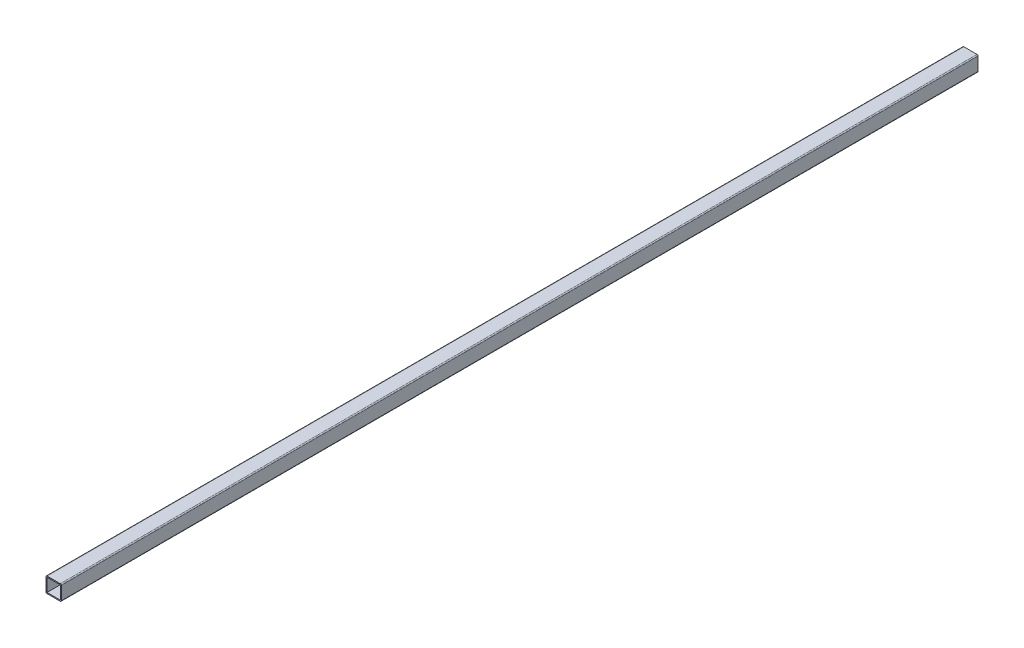
ISO-10303-21;
HEADER;
FILE_DESCRIPTION(('STEP AP214'),'2;1');
FILE_NAME('part.step','',(''),(''),'','','');
FILE_SCHEMA(('AUTOMOTIVE_DESIGN { 1 0 10303 214 1 1 1 1 }'));
ENDSEC;
DATA;
#1=APPLICATION_CONTEXT('core data for automotive mechanical design processes');
#2=APPLICATION_PROTOCOL_DEFINITION('international standard','automotive_design',2000,#1);
#3=PRODUCT_CONTEXT('',#1,'mechanical');
#4=PRODUCT('Part','Part','',(#3));
#5=PRODUCT_RELATED_PRODUCT_CATEGORY('part','',(#4));
#6=PRODUCT_DEFINITION_FORMATION('','',#4);
#7=PRODUCT_DEFINITION_CONTEXT('part definition',#1,'design');
#8=PRODUCT_DEFINITION('design','',#6,#7);
#9=PRODUCT_DEFINITION_SHAPE('','',#8);
#10=(LENGTH_UNIT() NAMED_UNIT(*) SI_UNIT(.MILLI.,.METRE.));
#11=(NAMED_UNIT(*) PLANE_ANGLE_UNIT() SI_UNIT($,.RADIAN.));
#12=(NAMED_UNIT(*) SI_UNIT($,.STERADIAN.) SOLID_ANGLE_UNIT());
#13=UNCERTAINTY_MEASURE_WITH_UNIT(LENGTH_MEASURE(1.E-05),#10,'distance_accuracy_value','');
#14=(GEOMETRIC_REPRESENTATION_CONTEXT(3) GLOBAL_UNCERTAINTY_ASSIGNED_CONTEXT((#13)) GLOBAL_UNIT_ASSIGNED_CONTEXT((#10,
#11,#12)) REPRESENTATION_CONTEXT('',''));
#15=CARTESIAN_POINT('',(0.,0.,0.));
#16=DIRECTION('',(0.,0.,1.));
#17=DIRECTION('',(1.,0.,0.));
#18=AXIS2_PLACEMENT_3D('',#15,#16,#17);
#19=CARTESIAN_POINT('',(0.,0.,1800.));
#20=DIRECTION('',(0.,0.,1.));
#21=DIRECTION('',(1.,0.,0.));
#22=AXIS2_PLACEMENT_3D('',#19,#20,#21);
#23=PLANE('',#22);
#24=DIRECTION('',(0.,-1.,0.));
#25=VECTOR('',#24,1.);
#26=CARTESIAN_POINT('',(-82.7027027027025,36.081081081081,1800.));
#27=LINE('',#26,#25);
#28=CARTESIAN_POINT('',(-82.7027027027025,34.081081081081,1800.));
#29=VERTEX_POINT('',#28);
#30=CARTESIAN_POINT('',(-82.7027027027025,8.08108108108097,1800.));
#31=VERTEX_POINT('',#30);
#32=EDGE_CURVE('E165',#29,#31,#27,.T.);
#33=ORIENTED_EDGE('',*,*,#32,.T.);
#34=CARTESIAN_POINT('',(-80.7027027027025,8.08108108108097,1800.));
#35=DIRECTION('',(0.,0.,1.));
#36=DIRECTION('',(1.,0.,0.));
#37=AXIS2_PLACEMENT_3D('',#34,#35,#36);
#38=CIRCLE('',#37,2.);
#39=CARTESIAN_POINT('',(-80.7027027027025,6.08108108108097,1800.));
#40=VERTEX_POINT('',#39);
#41=EDGE_CURVE('E208',#31,#40,#38,.T.);
#42=ORIENTED_EDGE('',*,*,#41,.T.);
#43=DIRECTION('',(1.,0.,0.));
#44=VECTOR('',#43,1.);
#45=CARTESIAN_POINT('',(-82.7027027027025,6.08108108108097,1800.));
#46=LINE('',#45,#44);
#47=CARTESIAN_POINT('',(-54.7027027027025,6.08108108108097,1800.));
#48=VERTEX_POINT('',#47);
#49=EDGE_CURVE('E168',#40,#48,#46,.T.);
#50=ORIENTED_EDGE('',*,*,#49,.T.);
#51=CARTESIAN_POINT('',(-54.7027027027025,8.08108108108097,1800.));
#52=DIRECTION('',(0.,0.,1.));
#53=DIRECTION('',(1.,0.,0.));
#54=AXIS2_PLACEMENT_3D('',#51,#52,#53);
#55=CIRCLE('',#54,2.);
#56=CARTESIAN_POINT('',(-52.7027027027025,8.08108108108097,1800.));
#57=VERTEX_POINT('',#56);
#58=EDGE_CURVE('E206',#48,#57,#55,.T.);
#59=ORIENTED_EDGE('',*,*,#58,.T.);
#60=DIRECTION('',(0.,1.,0.));
#61=VECTOR('',#60,1.);
#62=CARTESIAN_POINT('',(-52.7027027027025,36.081081081081,1800.));
#63=LINE('',#62,#61);
#64=CARTESIAN_POINT('',(-52.7027027027025,34.081081081081,1800.));
#65=VERTEX_POINT('',#64);
#66=EDGE_CURVE('E172',#57,#65,#63,.T.);
#67=ORIENTED_EDGE('',*,*,#66,.T.);
#68=CARTESIAN_POINT('',(-54.7027027027025,34.081081081081,1800.));
#69=DIRECTION('',(0.,0.,1.));
#70=DIRECTION('',(1.,0.,0.));
#71=AXIS2_PLACEMENT_3D('',#68,#69,#70);
#72=CIRCLE('',#71,2.);
#73=CARTESIAN_POINT('',(-54.7027027027025,36.081081081081,1800.));
#74=VERTEX_POINT('',#73);
#75=EDGE_CURVE('E54',#65,#74,#72,.T.);
#76=ORIENTED_EDGE('',*,*,#75,.T.);
#77=DIRECTION('',(-1.,0.,0.));
#78=VECTOR('',#77,1.);
#79=CARTESIAN_POINT('',(-82.7027027027025,36.081081081081,1800.));
#80=LINE('',#79,#78);
#81=CARTESIAN_POINT('',(-80.7027027027025,36.081081081081,1800.));
#82=VERTEX_POINT('',#81);
#83=EDGE_CURVE('E174',#74,#82,#80,.T.);
#84=ORIENTED_EDGE('',*,*,#83,.T.);
#85=CARTESIAN_POINT('',(-80.7027027027025,34.081081081081,1800.));
#86=DIRECTION('',(0.,0.,1.));
#87=DIRECTION('',(1.,0.,0.));
#88=AXIS2_PLACEMENT_3D('',#85,#86,#87);
#89=CIRCLE('',#88,2.);
#90=EDGE_CURVE('E203',#82,#29,#89,.T.);
#91=ORIENTED_EDGE('',*,*,#90,.T.);
#92=EDGE_LOOP('',(#33,#42,#50,#59,#67,#76,#84,#91));
#93=FACE_BOUND('',#92,.T.);
#94=DIRECTION('',(1.,0.,0.));
#95=VECTOR('',#94,1.);
#96=CARTESIAN_POINT('',(-80.7027027027025,8.08108108108097,1800.));
#97=LINE('',#96,#95);
#98=CARTESIAN_POINT('',(-80.7027027027025,8.08108108108097,1800.));
#99=VERTEX_POINT('',#98);
#100=CARTESIAN_POINT('',(-54.7027027027025,8.08108108108097,1800.));
#101=VERTEX_POINT('',#100);
#102=EDGE_CURVE('E134',#99,#101,#97,.T.);
#103=ORIENTED_EDGE('',*,*,#102,.F.);
#104=DIRECTION('',(0.,-1.,0.));
#105=VECTOR('',#104,1.);
#106=CARTESIAN_POINT('',(-80.7027027027025,34.081081081081,1800.));
#107=LINE('',#106,#105);
#108=CARTESIAN_POINT('',(-80.7027027027025,34.081081081081,1800.));
#109=VERTEX_POINT('',#108);
#110=EDGE_CURVE('E124',#109,#99,#107,.T.);
#111=ORIENTED_EDGE('',*,*,#110,.F.);
#112=DIRECTION('',(-1.,0.,0.));
#113=VECTOR('',#112,1.);
#114=CARTESIAN_POINT('',(-80.7027027027025,34.081081081081,1800.));
#115=LINE('',#114,#113);
#116=CARTESIAN_POINT('',(-54.7027027027025,34.081081081081,1800.));
#117=VERTEX_POINT('',#116);
#118=EDGE_CURVE('E149',#117,#109,#115,.T.);
#119=ORIENTED_EDGE('',*,*,#118,.F.);
#120=DIRECTION('',(0.,1.,0.));
#121=VECTOR('',#120,1.);
#122=CARTESIAN_POINT('',(-54.7027027027025,34.081081081081,1800.));
#123=LINE('',#122,#121);
#124=EDGE_CURVE('E147',#101,#117,#123,.T.);
#125=ORIENTED_EDGE('',*,*,#124,.F.);
#126=EDGE_LOOP('',(#103,#111,#119,#125));
#127=FACE_BOUND('',#126,.T.);
#128=ADVANCED_FACE('F33',(#93,#127),#23,.T.);
#129=CARTESIAN_POINT('',(0.,0.,0.));
#130=DIRECTION('',(0.,0.,1.));
#131=DIRECTION('',(1.,0.,0.));
#132=AXIS2_PLACEMENT_3D('',#129,#130,#131);
#133=PLANE('',#132);
#134=DIRECTION('',(1.,0.,0.));
#135=VECTOR('',#134,1.);
#136=CARTESIAN_POINT('',(-82.7027027027025,6.08108108108097,0.));
#137=LINE('',#136,#135);
#138=CARTESIAN_POINT('',(-80.7027027027025,6.08108108108097,0.));
#139=VERTEX_POINT('',#138);
#140=CARTESIAN_POINT('',(-54.7027027027025,6.08108108108097,0.));
#141=VERTEX_POINT('',#140);
#142=EDGE_CURVE('E179',#139,#141,#137,.T.);
#143=ORIENTED_EDGE('',*,*,#142,.F.);
#144=CARTESIAN_POINT('',(-80.7027027027025,8.08108108108097,0.));
#145=DIRECTION('',(0.,0.,1.));
#146=DIRECTION('',(1.,0.,0.));
#147=AXIS2_PLACEMENT_3D('',#144,#145,#146);
#148=CIRCLE('',#147,2.);
#149=CARTESIAN_POINT('',(-82.7027027027025,8.08108108108097,0.));
#150=VERTEX_POINT('',#149);
#151=EDGE_CURVE('E196',#139,#150,#148,.F.);
#152=ORIENTED_EDGE('',*,*,#151,.T.);
#153=DIRECTION('',(0.,-1.,0.));
#154=VECTOR('',#153,1.);
#155=CARTESIAN_POINT('',(-82.7027027027025,36.081081081081,0.));
#156=LINE('',#155,#154);
#157=CARTESIAN_POINT('',(-82.7027027027025,34.081081081081,0.));
#158=VERTEX_POINT('',#157);
#159=EDGE_CURVE('E142',#158,#150,#156,.T.);
#160=ORIENTED_EDGE('',*,*,#159,.F.);
#161=CARTESIAN_POINT('',(-80.7027027027025,34.081081081081,0.));
#162=DIRECTION('',(0.,0.,1.));
#163=DIRECTION('',(1.,0.,0.));
#164=AXIS2_PLACEMENT_3D('',#161,#162,#163);
#165=CIRCLE('',#164,2.);
#166=CARTESIAN_POINT('',(-80.7027027027025,36.081081081081,0.));
#167=VERTEX_POINT('',#166);
#168=EDGE_CURVE('E190',#158,#167,#165,.F.);
#169=ORIENTED_EDGE('',*,*,#168,.T.);
#170=DIRECTION('',(-1.,0.,0.));
#171=VECTOR('',#170,1.);
#172=CARTESIAN_POINT('',(-82.7027027027025,36.081081081081,0.));
#173=LINE('',#172,#171);
#174=CARTESIAN_POINT('',(-54.7027027027025,36.081081081081,0.));
#175=VERTEX_POINT('',#174);
#176=EDGE_CURVE('E169',#175,#167,#173,.T.);
#177=ORIENTED_EDGE('',*,*,#176,.F.);
#178=CARTESIAN_POINT('',(-54.7027027027025,34.081081081081,0.));
#179=DIRECTION('',(0.,0.,1.));
#180=DIRECTION('',(1.,0.,0.));
#181=AXIS2_PLACEMENT_3D('',#178,#179,#180);
#182=CIRCLE('',#181,2.);
#183=CARTESIAN_POINT('',(-52.7027027027025,34.081081081081,0.));
#184=VERTEX_POINT('',#183);
#185=EDGE_CURVE('E192',#175,#184,#182,.F.);
#186=ORIENTED_EDGE('',*,*,#185,.T.);
#187=DIRECTION('',(0.,1.,0.));
#188=VECTOR('',#187,1.);
#189=CARTESIAN_POINT('',(-52.7027027027025,36.081081081081,0.));
#190=LINE('',#189,#188);
#191=CARTESIAN_POINT('',(-52.7027027027025,8.08108108108097,0.));
#192=VERTEX_POINT('',#191);
#193=EDGE_CURVE('E182',#192,#184,#190,.T.);
#194=ORIENTED_EDGE('',*,*,#193,.F.);
#195=CARTESIAN_POINT('',(-54.7027027027025,8.08108108108097,0.));
#196=DIRECTION('',(0.,0.,1.));
#197=DIRECTION('',(1.,0.,0.));
#198=AXIS2_PLACEMENT_3D('',#195,#196,#197);
#199=CIRCLE('',#198,2.);
#200=EDGE_CURVE('E194',#192,#141,#199,.F.);
#201=ORIENTED_EDGE('',*,*,#200,.T.);
#202=EDGE_LOOP('',(#143,#152,#160,#169,#177,#186,#194,#201));
#203=FACE_BOUND('',#202,.T.);
#204=DIRECTION('',(0.,-1.,0.));
#205=VECTOR('',#204,1.);
#206=CARTESIAN_POINT('',(-80.7027027027025,34.081081081081,0.));
#207=LINE('',#206,#205);
#208=CARTESIAN_POINT('',(-80.7027027027025,34.081081081081,0.));
#209=VERTEX_POINT('',#208);
#210=CARTESIAN_POINT('',(-80.7027027027025,8.08108108108097,0.));
#211=VERTEX_POINT('',#210);
#212=EDGE_CURVE('E153',#209,#211,#207,.T.);
#213=ORIENTED_EDGE('',*,*,#212,.T.);
#214=DIRECTION('',(1.,0.,0.));
#215=VECTOR('',#214,1.);
#216=CARTESIAN_POINT('',(-80.7027027027025,8.08108108108097,0.));
#217=LINE('',#216,#215);
#218=CARTESIAN_POINT('',(-54.7027027027025,8.08108108108097,0.));
#219=VERTEX_POINT('',#218);
#220=EDGE_CURVE('E141',#211,#219,#217,.T.);
#221=ORIENTED_EDGE('',*,*,#220,.T.);
#222=DIRECTION('',(0.,1.,0.));
#223=VECTOR('',#222,1.);
#224=CARTESIAN_POINT('',(-54.7027027027025,34.081081081081,0.));
#225=LINE('',#224,#223);
#226=CARTESIAN_POINT('',(-54.7027027027025,34.081081081081,0.));
#227=VERTEX_POINT('',#226);
#228=EDGE_CURVE('E156',#219,#227,#225,.T.);
#229=ORIENTED_EDGE('',*,*,#228,.T.);
#230=DIRECTION('',(-1.,0.,0.));
#231=VECTOR('',#230,1.);
#232=CARTESIAN_POINT('',(-80.7027027027025,34.081081081081,0.));
#233=LINE('',#232,#231);
#234=EDGE_CURVE('E135',#227,#209,#233,.T.);
#235=ORIENTED_EDGE('',*,*,#234,.T.);
#236=EDGE_LOOP('',(#213,#221,#229,#235));
#237=FACE_BOUND('',#236,.T.);
#238=ADVANCED_FACE('F224',(#203,#237),#133,.F.);
#239=CARTESIAN_POINT('',(-82.7027027027025,36.081081081081,1800.));
#240=DIRECTION('',(1.,0.,0.));
#241=DIRECTION('',(0.,0.,-1.));
#242=AXIS2_PLACEMENT_3D('',#239,#240,#241);
#243=PLANE('',#242);
#244=ORIENTED_EDGE('',*,*,#159,.T.);
#245=DIRECTION('',(0.,0.,-1.));
#246=VECTOR('',#245,1.);
#247=CARTESIAN_POINT('',(-82.7027027027025,8.08108108108097,1800.));
#248=LINE('',#247,#246);
#249=EDGE_CURVE('E201',#150,#31,#248,.F.);
#250=ORIENTED_EDGE('',*,*,#249,.T.);
#251=ORIENTED_EDGE('',*,*,#32,.F.);
#252=DIRECTION('',(0.,0.,-1.));
#253=VECTOR('',#252,1.);
#254=CARTESIAN_POINT('',(-82.7027027027025,34.081081081081,1800.));
#255=LINE('',#254,#253);
#256=EDGE_CURVE('E198',#29,#158,#255,.T.);
#257=ORIENTED_EDGE('',*,*,#256,.T.);
#258=EDGE_LOOP('',(#244,#250,#251,#257));
#259=FACE_BOUND('',#258,.T.);
#260=ADVANCED_FACE('F237',(#259),#243,.F.);
#261=CARTESIAN_POINT('',(-82.7027027027025,6.08108108108097,1800.));
#262=DIRECTION('',(0.,1.,0.));
#263=DIRECTION('',(0.,0.,1.));
#264=AXIS2_PLACEMENT_3D('',#261,#262,#263);
#265=PLANE('',#264);
#266=ORIENTED_EDGE('',*,*,#49,.F.);
#267=DIRECTION('',(0.,0.,-1.));
#268=VECTOR('',#267,1.);
#269=CARTESIAN_POINT('',(-80.7027027027025,6.08108108108097,1800.));
#270=LINE('',#269,#268);
#271=EDGE_CURVE('E187',#40,#139,#270,.T.);
#272=ORIENTED_EDGE('',*,*,#271,.T.);
#273=ORIENTED_EDGE('',*,*,#142,.T.);
#274=DIRECTION('',(0.,0.,-1.));
#275=VECTOR('',#274,1.);
#276=CARTESIAN_POINT('',(-54.7027027027025,6.08108108108097,1800.));
#277=LINE('',#276,#275);
#278=EDGE_CURVE('E176',#141,#48,#277,.F.);
#279=ORIENTED_EDGE('',*,*,#278,.T.);
#280=EDGE_LOOP('',(#266,#272,#273,#279));
#281=FACE_BOUND('',#280,.T.);
#282=ADVANCED_FACE('F245',(#281),#265,.F.);
#283=CARTESIAN_POINT('',(-52.7027027027025,36.081081081081,1800.));
#284=DIRECTION('',(-1.,0.,0.));
#285=DIRECTION('',(0.,0.,1.));
#286=AXIS2_PLACEMENT_3D('',#283,#284,#285);
#287=PLANE('',#286);
#288=ORIENTED_EDGE('',*,*,#66,.F.);
#289=DIRECTION('',(0.,0.,-1.));
#290=VECTOR('',#289,1.);
#291=CARTESIAN_POINT('',(-52.7027027027025,8.08108108108097,1800.));
#292=LINE('',#291,#290);
#293=EDGE_CURVE('E212',#57,#192,#292,.T.);
#294=ORIENTED_EDGE('',*,*,#293,.T.);
#295=ORIENTED_EDGE('',*,*,#193,.T.);
#296=DIRECTION('',(0.,0.,-1.));
#297=VECTOR('',#296,1.);
#298=CARTESIAN_POINT('',(-52.7027027027025,34.081081081081,1800.));
#299=LINE('',#298,#297);
#300=EDGE_CURVE('E210',#184,#65,#299,.F.);
#301=ORIENTED_EDGE('',*,*,#300,.T.);
#302=EDGE_LOOP('',(#288,#294,#295,#301));
#303=FACE_BOUND('',#302,.T.);
#304=ADVANCED_FACE('F218',(#303),#287,.F.);
#305=CARTESIAN_POINT('',(-82.7027027027025,36.081081081081,1800.));
#306=DIRECTION('',(0.,-1.,0.));
#307=DIRECTION('',(0.,0.,-1.));
#308=AXIS2_PLACEMENT_3D('',#305,#306,#307);
#309=PLANE('',#308);
#310=ORIENTED_EDGE('',*,*,#83,.F.);
#311=DIRECTION('',(0.,0.,-1.));
#312=VECTOR('',#311,1.);
#313=CARTESIAN_POINT('',(-54.7027027027025,36.081081081081,1800.));
#314=LINE('',#313,#312);
#315=EDGE_CURVE('E11',#74,#175,#314,.T.);
#316=ORIENTED_EDGE('',*,*,#315,.T.);
#317=ORIENTED_EDGE('',*,*,#176,.T.);
#318=DIRECTION('',(0.,0.,-1.));
#319=VECTOR('',#318,1.);
#320=CARTESIAN_POINT('',(-80.7027027027025,36.081081081081,1800.));
#321=LINE('',#320,#319);
#322=EDGE_CURVE('E41',#167,#82,#321,.F.);
#323=ORIENTED_EDGE('',*,*,#322,.T.);
#324=EDGE_LOOP('',(#310,#316,#317,#323));
#325=FACE_BOUND('',#324,.T.);
#326=ADVANCED_FACE('F230',(#325),#309,.F.);
#327=CARTESIAN_POINT('',(-80.7027027027025,34.081081081081,1800.));
#328=DIRECTION('',(1.,0.,0.));
#329=DIRECTION('',(0.,0.,-1.));
#330=AXIS2_PLACEMENT_3D('',#327,#328,#329);
#331=PLANE('',#330);
#332=ORIENTED_EDGE('',*,*,#212,.F.);
#333=DIRECTION('',(0.,0.,-1.));
#334=VECTOR('',#333,1.);
#335=CARTESIAN_POINT('',(-80.7027027027025,34.081081081081,1800.));
#336=LINE('',#335,#334);
#337=EDGE_CURVE('E130',#109,#209,#336,.T.);
#338=ORIENTED_EDGE('',*,*,#337,.F.);
#339=ORIENTED_EDGE('',*,*,#110,.T.);
#340=DIRECTION('',(0.,0.,-1.));
#341=VECTOR('',#340,1.);
#342=CARTESIAN_POINT('',(-80.7027027027025,8.08108108108097,1800.));
#343=LINE('',#342,#341);
#344=EDGE_CURVE('E127',#99,#211,#343,.T.);
#345=ORIENTED_EDGE('',*,*,#344,.T.);
#346=EDGE_LOOP('',(#332,#338,#339,#345));
#347=FACE_BOUND('',#346,.T.);
#348=ADVANCED_FACE('F126',(#347),#331,.T.);
#349=CARTESIAN_POINT('',(-80.7027027027025,8.08108108108097,1800.));
#350=DIRECTION('',(0.,1.,0.));
#351=DIRECTION('',(-1.,0.,0.));
#352=AXIS2_PLACEMENT_3D('',#349,#350,#351);
#353=PLANE('',#352);
#354=ORIENTED_EDGE('',*,*,#220,.F.);
#355=ORIENTED_EDGE('',*,*,#344,.F.);
#356=ORIENTED_EDGE('',*,*,#102,.T.);
#357=DIRECTION('',(0.,0.,-1.));
#358=VECTOR('',#357,1.);
#359=CARTESIAN_POINT('',(-54.7027027027025,8.08108108108097,1800.));
#360=LINE('',#359,#358);
#361=EDGE_CURVE('E143',#101,#219,#360,.T.);
#362=ORIENTED_EDGE('',*,*,#361,.T.);
#363=EDGE_LOOP('',(#354,#355,#356,#362));
#364=FACE_BOUND('',#363,.T.);
#365=ADVANCED_FACE('F138',(#364),#353,.T.);
#366=CARTESIAN_POINT('',(-54.7027027027025,34.081081081081,1800.));
#367=DIRECTION('',(-1.,0.,0.));
#368=DIRECTION('',(0.,0.,1.));
#369=AXIS2_PLACEMENT_3D('',#366,#367,#368);
#370=PLANE('',#369);
#371=ORIENTED_EDGE('',*,*,#228,.F.);
#372=ORIENTED_EDGE('',*,*,#361,.F.);
#373=ORIENTED_EDGE('',*,*,#124,.T.);
#374=DIRECTION('',(0.,0.,-1.));
#375=VECTOR('',#374,1.);
#376=CARTESIAN_POINT('',(-54.7027027027025,34.081081081081,1800.));
#377=LINE('',#376,#375);
#378=EDGE_CURVE('E162',#117,#227,#377,.T.);
#379=ORIENTED_EDGE('',*,*,#378,.T.);
#380=EDGE_LOOP('',(#371,#372,#373,#379));
#381=FACE_BOUND('',#380,.T.);
#382=ADVANCED_FACE('F300',(#381),#370,.T.);
#383=CARTESIAN_POINT('',(-80.7027027027025,34.081081081081,1800.));
#384=DIRECTION('',(0.,-1.,0.));
#385=DIRECTION('',(0.,0.,-1.));
#386=AXIS2_PLACEMENT_3D('',#383,#384,#385);
#387=PLANE('',#386);
#388=ORIENTED_EDGE('',*,*,#234,.F.);
#389=ORIENTED_EDGE('',*,*,#378,.F.);
#390=ORIENTED_EDGE('',*,*,#118,.T.);
#391=ORIENTED_EDGE('',*,*,#337,.T.);
#392=EDGE_LOOP('',(#388,#389,#390,#391));
#393=FACE_BOUND('',#392,.T.);
#394=ADVANCED_FACE('F254',(#393),#387,.T.);
#395=CARTESIAN_POINT('',(-80.7027027027025,8.08108108108097,1800.));
#396=DIRECTION('',(0.,0.,-1.));
#397=DIRECTION('',(-1.,0.,0.));
#398=AXIS2_PLACEMENT_3D('',#395,#396,#397);
#399=CYLINDRICAL_SURFACE('',#398,2.);
#400=ORIENTED_EDGE('',*,*,#41,.F.);
#401=ORIENTED_EDGE('',*,*,#249,.F.);
#402=ORIENTED_EDGE('',*,*,#151,.F.);
#403=ORIENTED_EDGE('',*,*,#271,.F.);
#404=EDGE_LOOP('',(#400,#401,#402,#403));
#405=FACE_BOUND('',#404,.T.);
#406=ADVANCED_FACE('F242',(#405),#399,.T.);
#407=CARTESIAN_POINT('',(-54.7027027027025,8.08108108108097,1800.));
#408=DIRECTION('',(0.,0.,-1.));
#409=DIRECTION('',(-1.,0.,0.));
#410=AXIS2_PLACEMENT_3D('',#407,#408,#409);
#411=CYLINDRICAL_SURFACE('',#410,2.);
#412=ORIENTED_EDGE('',*,*,#58,.F.);
#413=ORIENTED_EDGE('',*,*,#278,.F.);
#414=ORIENTED_EDGE('',*,*,#200,.F.);
#415=ORIENTED_EDGE('',*,*,#293,.F.);
#416=EDGE_LOOP('',(#412,#413,#414,#415));
#417=FACE_BOUND('',#416,.T.);
#418=ADVANCED_FACE('F247',(#417),#411,.T.);
#419=CARTESIAN_POINT('',(-54.7027027027025,34.081081081081,1800.));
#420=DIRECTION('',(0.,0.,-1.));
#421=DIRECTION('',(-1.,0.,0.));
#422=AXIS2_PLACEMENT_3D('',#419,#420,#421);
#423=CYLINDRICAL_SURFACE('',#422,2.);
#424=ORIENTED_EDGE('',*,*,#75,.F.);
#425=ORIENTED_EDGE('',*,*,#300,.F.);
#426=ORIENTED_EDGE('',*,*,#185,.F.);
#427=ORIENTED_EDGE('',*,*,#315,.F.);
#428=EDGE_LOOP('',(#424,#425,#426,#427));
#429=FACE_BOUND('',#428,.T.);
#430=ADVANCED_FACE('F229',(#429),#423,.T.);
#431=CARTESIAN_POINT('',(-80.7027027027025,34.081081081081,1800.));
#432=DIRECTION('',(0.,0.,-1.));
#433=DIRECTION('',(-1.,0.,0.));
#434=AXIS2_PLACEMENT_3D('',#431,#432,#433);
#435=CYLINDRICAL_SURFACE('',#434,2.);
#436=ORIENTED_EDGE('',*,*,#90,.F.);
#437=ORIENTED_EDGE('',*,*,#322,.F.);
#438=ORIENTED_EDGE('',*,*,#168,.F.);
#439=ORIENTED_EDGE('',*,*,#256,.F.);
#440=EDGE_LOOP('',(#436,#437,#438,#439));
#441=FACE_BOUND('',#440,.T.);
#442=ADVANCED_FACE('F35',(#441),#435,.T.);
#443=CLOSED_SHELL('',(#128,#238,#260,#282,#304,#326,#348,#365,#382,#394,#406,#418,#430,#442));
#444=MANIFOLD_SOLID_BREP('B2',#443);
#445=ADVANCED_BREP_SHAPE_REPRESENTATION('',(#18,#444),#14);
#446=SHAPE_DEFINITION_REPRESENTATION(#9,#445);
ENDSEC;
END-ISO-10303-21;
